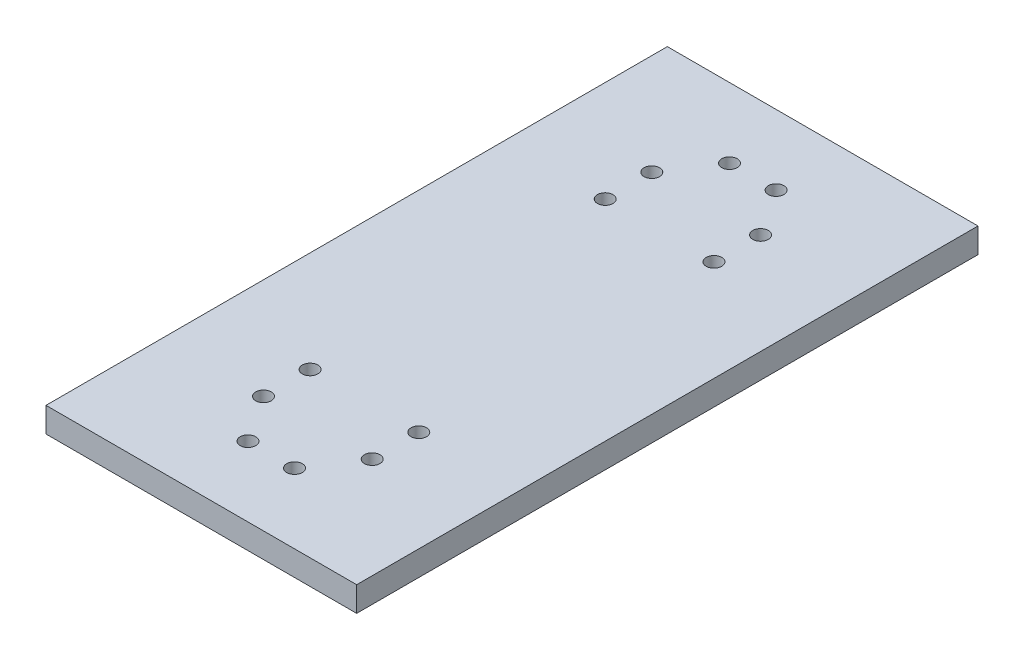
ISO-10303-21;
HEADER;
FILE_DESCRIPTION(('STEP AP214'),'2;1');
FILE_NAME('part.step','',(''),(''),'','','');
FILE_SCHEMA(('AUTOMOTIVE_DESIGN { 1 0 10303 214 1 1 1 1 }'));
ENDSEC;
DATA;
#1=APPLICATION_CONTEXT('core data for automotive mechanical design processes');
#2=APPLICATION_PROTOCOL_DEFINITION('international standard','automotive_design',2000,#1);
#3=PRODUCT_CONTEXT('',#1,'mechanical');
#4=PRODUCT('Part','Part','',(#3));
#5=PRODUCT_RELATED_PRODUCT_CATEGORY('part','',(#4));
#6=PRODUCT_DEFINITION_FORMATION('','',#4);
#7=PRODUCT_DEFINITION_CONTEXT('part definition',#1,'design');
#8=PRODUCT_DEFINITION('design','',#6,#7);
#9=PRODUCT_DEFINITION_SHAPE('','',#8);
#10=(LENGTH_UNIT() NAMED_UNIT(*) SI_UNIT(.MILLI.,.METRE.));
#11=(NAMED_UNIT(*) PLANE_ANGLE_UNIT() SI_UNIT($,.RADIAN.));
#12=(NAMED_UNIT(*) SI_UNIT($,.STERADIAN.) SOLID_ANGLE_UNIT());
#13=UNCERTAINTY_MEASURE_WITH_UNIT(LENGTH_MEASURE(1.E-05),#10,'distance_accuracy_value','');
#14=(GEOMETRIC_REPRESENTATION_CONTEXT(3) GLOBAL_UNCERTAINTY_ASSIGNED_CONTEXT((#13)) GLOBAL_UNIT_ASSIGNED_CONTEXT((#10,
#11,#12)) REPRESENTATION_CONTEXT('',''));
#15=CARTESIAN_POINT('',(0.,0.,0.));
#16=DIRECTION('',(0.,0.,1.));
#17=DIRECTION('',(1.,0.,0.));
#18=AXIS2_PLACEMENT_3D('',#15,#16,#17);
#19=CARTESIAN_POINT('',(-50.,8.,100.));
#20=DIRECTION('',(1.,0.,0.));
#21=DIRECTION('',(0.,0.,-1.));
#22=AXIS2_PLACEMENT_3D('',#19,#20,#21);
#23=PLANE('',#22);
#24=DIRECTION('',(0.,0.,1.));
#25=VECTOR('',#24,1.);
#26=CARTESIAN_POINT('',(-50.,0.,100.));
#27=LINE('',#26,#25);
#28=CARTESIAN_POINT('',(-50.,0.,-100.));
#29=VERTEX_POINT('',#28);
#30=CARTESIAN_POINT('',(-50.,0.,100.));
#31=VERTEX_POINT('',#30);
#32=EDGE_CURVE('E96',#29,#31,#27,.T.);
#33=ORIENTED_EDGE('',*,*,#32,.T.);
#34=DIRECTION('',(0.,-1.,0.));
#35=VECTOR('',#34,1.);
#36=CARTESIAN_POINT('',(-50.,8.,100.));
#37=LINE('',#36,#35);
#38=CARTESIAN_POINT('',(-50.,8.,100.));
#39=VERTEX_POINT('',#38);
#40=EDGE_CURVE('E11',#39,#31,#37,.T.);
#41=ORIENTED_EDGE('',*,*,#40,.F.);
#42=DIRECTION('',(0.,0.,1.));
#43=VECTOR('',#42,1.);
#44=CARTESIAN_POINT('',(-50.,8.,100.));
#45=LINE('',#44,#43);
#46=CARTESIAN_POINT('',(-50.,8.,-100.));
#47=VERTEX_POINT('',#46);
#48=EDGE_CURVE('E84',#47,#39,#45,.T.);
#49=ORIENTED_EDGE('',*,*,#48,.F.);
#50=DIRECTION('',(0.,-1.,0.));
#51=VECTOR('',#50,1.);
#52=CARTESIAN_POINT('',(-50.,8.,-100.));
#53=LINE('',#52,#51);
#54=EDGE_CURVE('E92',#47,#29,#53,.T.);
#55=ORIENTED_EDGE('',*,*,#54,.T.);
#56=EDGE_LOOP('',(#33,#41,#49,#55));
#57=FACE_BOUND('',#56,.T.);
#58=ADVANCED_FACE('F33',(#57),#23,.F.);
#59=CARTESIAN_POINT('',(50.,8.,100.));
#60=DIRECTION('',(0.,0.,-1.));
#61=DIRECTION('',(-1.,0.,0.));
#62=AXIS2_PLACEMENT_3D('',#59,#60,#61);
#63=PLANE('',#62);
#64=DIRECTION('',(1.,0.,0.));
#65=VECTOR('',#64,1.);
#66=CARTESIAN_POINT('',(50.,0.,100.));
#67=LINE('',#66,#65);
#68=CARTESIAN_POINT('',(50.,0.,100.));
#69=VERTEX_POINT('',#68);
#70=EDGE_CURVE('E88',#31,#69,#67,.T.);
#71=ORIENTED_EDGE('',*,*,#70,.T.);
#72=DIRECTION('',(0.,-1.,0.));
#73=VECTOR('',#72,1.);
#74=CARTESIAN_POINT('',(50.,8.,100.));
#75=LINE('',#74,#73);
#76=CARTESIAN_POINT('',(50.,8.,100.));
#77=VERTEX_POINT('',#76);
#78=EDGE_CURVE('E41',#77,#69,#75,.T.);
#79=ORIENTED_EDGE('',*,*,#78,.F.);
#80=DIRECTION('',(1.,0.,0.));
#81=VECTOR('',#80,1.);
#82=CARTESIAN_POINT('',(50.,8.,100.));
#83=LINE('',#82,#81);
#84=EDGE_CURVE('E79',#39,#77,#83,.T.);
#85=ORIENTED_EDGE('',*,*,#84,.F.);
#86=ORIENTED_EDGE('',*,*,#40,.T.);
#87=EDGE_LOOP('',(#71,#79,#85,#86));
#88=FACE_BOUND('',#87,.T.);
#89=ADVANCED_FACE('F87',(#88),#63,.F.);
#90=CARTESIAN_POINT('',(50.,8.,100.));
#91=DIRECTION('',(-1.,0.,0.));
#92=DIRECTION('',(0.,0.,1.));
#93=AXIS2_PLACEMENT_3D('',#90,#91,#92);
#94=PLANE('',#93);
#95=DIRECTION('',(0.,0.,-1.));
#96=VECTOR('',#95,1.);
#97=CARTESIAN_POINT('',(50.,0.,100.));
#98=LINE('',#97,#96);
#99=CARTESIAN_POINT('',(50.,0.,-100.));
#100=VERTEX_POINT('',#99);
#101=EDGE_CURVE('E66',#69,#100,#98,.T.);
#102=ORIENTED_EDGE('',*,*,#101,.T.);
#103=DIRECTION('',(0.,-1.,0.));
#104=VECTOR('',#103,1.);
#105=CARTESIAN_POINT('',(50.,8.,-100.));
#106=LINE('',#105,#104);
#107=CARTESIAN_POINT('',(50.,8.,-100.));
#108=VERTEX_POINT('',#107);
#109=EDGE_CURVE('E89',#108,#100,#106,.T.);
#110=ORIENTED_EDGE('',*,*,#109,.F.);
#111=DIRECTION('',(0.,0.,-1.));
#112=VECTOR('',#111,1.);
#113=CARTESIAN_POINT('',(50.,8.,100.));
#114=LINE('',#113,#112);
#115=EDGE_CURVE('E82',#77,#108,#114,.T.);
#116=ORIENTED_EDGE('',*,*,#115,.F.);
#117=ORIENTED_EDGE('',*,*,#78,.T.);
#118=EDGE_LOOP('',(#102,#110,#116,#117));
#119=FACE_BOUND('',#118,.T.);
#120=ADVANCED_FACE('F90',(#119),#94,.F.);
#121=CARTESIAN_POINT('',(50.,8.,-100.));
#122=DIRECTION('',(0.,0.,1.));
#123=DIRECTION('',(1.,0.,0.));
#124=AXIS2_PLACEMENT_3D('',#121,#122,#123);
#125=PLANE('',#124);
#126=DIRECTION('',(-1.,0.,0.));
#127=VECTOR('',#126,1.);
#128=CARTESIAN_POINT('',(50.,0.,-100.));
#129=LINE('',#128,#127);
#130=EDGE_CURVE('E72',#100,#29,#129,.T.);
#131=ORIENTED_EDGE('',*,*,#130,.T.);
#132=ORIENTED_EDGE('',*,*,#54,.F.);
#133=DIRECTION('',(-1.,0.,0.));
#134=VECTOR('',#133,1.);
#135=CARTESIAN_POINT('',(50.,8.,-100.));
#136=LINE('',#135,#134);
#137=EDGE_CURVE('E49',#108,#47,#136,.T.);
#138=ORIENTED_EDGE('',*,*,#137,.F.);
#139=ORIENTED_EDGE('',*,*,#109,.T.);
#140=EDGE_LOOP('',(#131,#132,#138,#139));
#141=FACE_BOUND('',#140,.T.);
#142=ADVANCED_FACE('F104',(#141),#125,.F.);
#143=CARTESIAN_POINT('',(0.,8.,0.));
#144=DIRECTION('',(0.,1.,0.));
#145=DIRECTION('',(0.,0.,1.));
#146=AXIS2_PLACEMENT_3D('',#143,#144,#145);
#147=PLANE('',#146);
#148=CARTESIAN_POINT('',(-7.49999999999884,8.00000000000572,77.5000000000039));
#149=DIRECTION('',(0.,-1.,0.));
#150=DIRECTION('',(0.,0.,1.));
#151=AXIS2_PLACEMENT_3D('',#148,#149,#150);
#152=CIRCLE('',#151,2.50000000000002);
#153=CARTESIAN_POINT('',(-7.49999999999884,8.00000000000572,80.0000000000039));
#154=VERTEX_POINT('',#153);
#155=EDGE_CURVE('E178',#154,#154,#152,.T.);
#156=ORIENTED_EDGE('',*,*,#155,.T.);
#157=EDGE_LOOP('',(#156));
#158=FACE_BOUND('',#157,.T.);
#159=CARTESIAN_POINT('',(-7.49999999999884,8.00000000000572,-77.5000000000039));
#160=DIRECTION('',(0.,1.,0.));
#161=DIRECTION('',(0.,0.,-1.));
#162=AXIS2_PLACEMENT_3D('',#159,#160,#161);
#163=CIRCLE('',#162,2.50000000000002);
#164=CARTESIAN_POINT('',(-7.49999999999884,8.00000000000572,-80.0000000000039));
#165=VERTEX_POINT('',#164);
#166=EDGE_CURVE('E172',#165,#165,#163,.T.);
#167=ORIENTED_EDGE('',*,*,#166,.F.);
#168=EDGE_LOOP('',(#167));
#169=FACE_BOUND('',#168,.T.);
#170=CARTESIAN_POINT('',(-17.5000000000032,8.00000000000572,47.5000000000039));
#171=DIRECTION('',(0.,-1.,0.));
#172=DIRECTION('',(0.,0.,1.));
#173=AXIS2_PLACEMENT_3D('',#170,#171,#172);
#174=CIRCLE('',#173,2.50000000000002);
#175=CARTESIAN_POINT('',(-17.5000000000032,8.00000000000572,50.0000000000039));
#176=VERTEX_POINT('',#175);
#177=EDGE_CURVE('E166',#176,#176,#174,.T.);
#178=ORIENTED_EDGE('',*,*,#177,.T.);
#179=EDGE_LOOP('',(#178));
#180=FACE_BOUND('',#179,.T.);
#181=CARTESIAN_POINT('',(-17.5000000000032,8.00000000000572,-47.5000000000039));
#182=DIRECTION('',(0.,1.,0.));
#183=DIRECTION('',(0.,0.,-1.));
#184=AXIS2_PLACEMENT_3D('',#181,#182,#183);
#185=CIRCLE('',#184,2.50000000000002);
#186=CARTESIAN_POINT('',(-17.5000000000032,8.00000000000572,-50.0000000000039));
#187=VERTEX_POINT('',#186);
#188=EDGE_CURVE('E160',#187,#187,#185,.T.);
#189=ORIENTED_EDGE('',*,*,#188,.F.);
#190=EDGE_LOOP('',(#189));
#191=FACE_BOUND('',#190,.T.);
#192=CARTESIAN_POINT('',(-17.5000000000032,8.00000000000572,62.5000000000038));
#193=DIRECTION('',(0.,-1.,0.));
#194=DIRECTION('',(0.,0.,1.));
#195=AXIS2_PLACEMENT_3D('',#192,#193,#194);
#196=CIRCLE('',#195,2.50000000000002);
#197=CARTESIAN_POINT('',(-17.5000000000032,8.00000000000572,65.0000000000039));
#198=VERTEX_POINT('',#197);
#199=EDGE_CURVE('E154',#198,#198,#196,.T.);
#200=ORIENTED_EDGE('',*,*,#199,.T.);
#201=EDGE_LOOP('',(#200));
#202=FACE_BOUND('',#201,.T.);
#203=CARTESIAN_POINT('',(-17.5000000000032,8.00000000000572,-62.5000000000038));
#204=DIRECTION('',(0.,1.,0.));
#205=DIRECTION('',(0.,0.,-1.));
#206=AXIS2_PLACEMENT_3D('',#203,#204,#205);
#207=CIRCLE('',#206,2.50000000000002);
#208=CARTESIAN_POINT('',(-17.5000000000032,8.00000000000572,-65.0000000000039));
#209=VERTEX_POINT('',#208);
#210=EDGE_CURVE('E148',#209,#209,#207,.T.);
#211=ORIENTED_EDGE('',*,*,#210,.F.);
#212=EDGE_LOOP('',(#211));
#213=FACE_BOUND('',#212,.T.);
#214=CARTESIAN_POINT('',(7.49999999999884,8.00000000000572,77.5000000000039));
#215=DIRECTION('',(0.,1.,0.));
#216=DIRECTION('',(0.,0.,1.));
#217=AXIS2_PLACEMENT_3D('',#214,#215,#216);
#218=CIRCLE('',#217,2.50000000000002);
#219=CARTESIAN_POINT('',(7.49999999999884,8.00000000000572,80.0000000000039));
#220=VERTEX_POINT('',#219);
#221=EDGE_CURVE('E142',#220,#220,#218,.T.);
#222=ORIENTED_EDGE('',*,*,#221,.F.);
#223=EDGE_LOOP('',(#222));
#224=FACE_BOUND('',#223,.T.);
#225=CARTESIAN_POINT('',(17.5000000000032,8.00000000000572,47.5000000000039));
#226=DIRECTION('',(0.,1.,0.));
#227=DIRECTION('',(0.,0.,1.));
#228=AXIS2_PLACEMENT_3D('',#225,#226,#227);
#229=CIRCLE('',#228,2.50000000000002);
#230=CARTESIAN_POINT('',(17.5000000000032,8.00000000000572,50.0000000000039));
#231=VERTEX_POINT('',#230);
#232=EDGE_CURVE('E136',#231,#231,#229,.T.);
#233=ORIENTED_EDGE('',*,*,#232,.F.);
#234=EDGE_LOOP('',(#233));
#235=FACE_BOUND('',#234,.T.);
#236=CARTESIAN_POINT('',(17.5000000000032,8.00000000000572,62.5000000000038));
#237=DIRECTION('',(0.,1.,0.));
#238=DIRECTION('',(0.,0.,1.));
#239=AXIS2_PLACEMENT_3D('',#236,#237,#238);
#240=CIRCLE('',#239,2.50000000000002);
#241=CARTESIAN_POINT('',(17.5000000000032,8.00000000000572,65.0000000000039));
#242=VERTEX_POINT('',#241);
#243=EDGE_CURVE('E130',#242,#242,#240,.T.);
#244=ORIENTED_EDGE('',*,*,#243,.F.);
#245=EDGE_LOOP('',(#244));
#246=FACE_BOUND('',#245,.T.);
#247=CARTESIAN_POINT('',(7.49999999999884,8.00000000000572,-77.5000000000039));
#248=DIRECTION('',(0.,-1.,0.));
#249=DIRECTION('',(0.,0.,-1.));
#250=AXIS2_PLACEMENT_3D('',#247,#248,#249);
#251=CIRCLE('',#250,2.50000000000002);
#252=CARTESIAN_POINT('',(7.49999999999884,8.00000000000572,-80.0000000000039));
#253=VERTEX_POINT('',#252);
#254=EDGE_CURVE('E119',#253,#253,#251,.T.);
#255=ORIENTED_EDGE('',*,*,#254,.T.);
#256=EDGE_LOOP('',(#255));
#257=FACE_BOUND('',#256,.T.);
#258=CARTESIAN_POINT('',(17.5000000000032,8.00000000000572,-47.5000000000039));
#259=DIRECTION('',(0.,-1.,0.));
#260=DIRECTION('',(0.,0.,-1.));
#261=AXIS2_PLACEMENT_3D('',#258,#259,#260);
#262=CIRCLE('',#261,2.50000000000002);
#263=CARTESIAN_POINT('',(17.5000000000032,8.00000000000572,-50.0000000000039));
#264=VERTEX_POINT('',#263);
#265=EDGE_CURVE('E113',#264,#264,#262,.T.);
#266=ORIENTED_EDGE('',*,*,#265,.T.);
#267=EDGE_LOOP('',(#266));
#268=FACE_BOUND('',#267,.T.);
#269=CARTESIAN_POINT('',(17.5000000000032,8.00000000000572,-62.5000000000038));
#270=DIRECTION('',(0.,-1.,0.));
#271=DIRECTION('',(0.,0.,-1.));
#272=AXIS2_PLACEMENT_3D('',#269,#270,#271);
#273=CIRCLE('',#272,2.50000000000002);
#274=CARTESIAN_POINT('',(17.5000000000032,8.00000000000572,-65.0000000000039));
#275=VERTEX_POINT('',#274);
#276=EDGE_CURVE('E99',#275,#275,#273,.T.);
#277=ORIENTED_EDGE('',*,*,#276,.T.);
#278=EDGE_LOOP('',(#277));
#279=FACE_BOUND('',#278,.T.);
#280=ORIENTED_EDGE('',*,*,#48,.T.);
#281=ORIENTED_EDGE('',*,*,#84,.T.);
#282=ORIENTED_EDGE('',*,*,#115,.T.);
#283=ORIENTED_EDGE('',*,*,#137,.T.);
#284=EDGE_LOOP('',(#280,#281,#282,#283));
#285=FACE_BOUND('',#284,.T.);
#286=ADVANCED_FACE('F80',(#158,#169,#180,#191,#202,#213,#224,#235,#246,#257,#268,#279,#285),
#147,.T.);
#287=CARTESIAN_POINT('',(0.,0.,0.));
#288=DIRECTION('',(0.,1.,0.));
#289=DIRECTION('',(0.,0.,1.));
#290=AXIS2_PLACEMENT_3D('',#287,#288,#289);
#291=PLANE('',#290);
#292=CARTESIAN_POINT('',(-7.49999999999884,5.71764857681956E-12,77.5000000000039));
#293=DIRECTION('',(0.,-1.,0.));
#294=DIRECTION('',(0.,0.,1.));
#295=AXIS2_PLACEMENT_3D('',#292,#293,#294);
#296=CIRCLE('',#295,2.50000000000002);
#297=CARTESIAN_POINT('',(-7.49999999999884,5.71764857681956E-12,80.0000000000039));
#298=VERTEX_POINT('',#297);
#299=EDGE_CURVE('E175',#298,#298,#296,.T.);
#300=ORIENTED_EDGE('',*,*,#299,.F.);
#301=EDGE_LOOP('',(#300));
#302=FACE_BOUND('',#301,.T.);
#303=CARTESIAN_POINT('',(-7.49999999999884,5.71764857681956E-12,-77.5000000000039));
#304=DIRECTION('',(0.,1.,0.));
#305=DIRECTION('',(0.,0.,-1.));
#306=AXIS2_PLACEMENT_3D('',#303,#304,#305);
#307=CIRCLE('',#306,2.50000000000002);
#308=CARTESIAN_POINT('',(-7.49999999999884,5.71764857681956E-12,-80.0000000000039));
#309=VERTEX_POINT('',#308);
#310=EDGE_CURVE('E169',#309,#309,#307,.T.);
#311=ORIENTED_EDGE('',*,*,#310,.T.);
#312=EDGE_LOOP('',(#311));
#313=FACE_BOUND('',#312,.T.);
#314=CARTESIAN_POINT('',(-17.5000000000032,5.71764857681956E-12,47.5000000000039));
#315=DIRECTION('',(0.,-1.,0.));
#316=DIRECTION('',(0.,0.,1.));
#317=AXIS2_PLACEMENT_3D('',#314,#315,#316);
#318=CIRCLE('',#317,2.50000000000002);
#319=CARTESIAN_POINT('',(-17.5000000000032,5.71764857681956E-12,50.0000000000039));
#320=VERTEX_POINT('',#319);
#321=EDGE_CURVE('E163',#320,#320,#318,.T.);
#322=ORIENTED_EDGE('',*,*,#321,.F.);
#323=EDGE_LOOP('',(#322));
#324=FACE_BOUND('',#323,.T.);
#325=CARTESIAN_POINT('',(-17.5000000000032,5.71764857681956E-12,-47.5000000000039));
#326=DIRECTION('',(0.,1.,0.));
#327=DIRECTION('',(0.,0.,-1.));
#328=AXIS2_PLACEMENT_3D('',#325,#326,#327);
#329=CIRCLE('',#328,2.50000000000002);
#330=CARTESIAN_POINT('',(-17.5000000000032,5.71764857681956E-12,-50.0000000000039));
#331=VERTEX_POINT('',#330);
#332=EDGE_CURVE('E157',#331,#331,#329,.T.);
#333=ORIENTED_EDGE('',*,*,#332,.T.);
#334=EDGE_LOOP('',(#333));
#335=FACE_BOUND('',#334,.T.);
#336=CARTESIAN_POINT('',(-17.5000000000032,5.71764857681956E-12,62.5000000000038));
#337=DIRECTION('',(0.,-1.,0.));
#338=DIRECTION('',(0.,0.,1.));
#339=AXIS2_PLACEMENT_3D('',#336,#337,#338);
#340=CIRCLE('',#339,2.50000000000002);
#341=CARTESIAN_POINT('',(-17.5000000000032,5.71764857681956E-12,65.0000000000039));
#342=VERTEX_POINT('',#341);
#343=EDGE_CURVE('E151',#342,#342,#340,.T.);
#344=ORIENTED_EDGE('',*,*,#343,.F.);
#345=EDGE_LOOP('',(#344));
#346=FACE_BOUND('',#345,.T.);
#347=CARTESIAN_POINT('',(-17.5000000000032,5.71764857681956E-12,-62.5000000000038));
#348=DIRECTION('',(0.,1.,0.));
#349=DIRECTION('',(0.,0.,-1.));
#350=AXIS2_PLACEMENT_3D('',#347,#348,#349);
#351=CIRCLE('',#350,2.50000000000002);
#352=CARTESIAN_POINT('',(-17.5000000000032,5.71764857681956E-12,-65.0000000000039));
#353=VERTEX_POINT('',#352);
#354=EDGE_CURVE('E145',#353,#353,#351,.T.);
#355=ORIENTED_EDGE('',*,*,#354,.T.);
#356=EDGE_LOOP('',(#355));
#357=FACE_BOUND('',#356,.T.);
#358=CARTESIAN_POINT('',(7.49999999999884,5.71764857681956E-12,77.5000000000039));
#359=DIRECTION('',(0.,1.,0.));
#360=DIRECTION('',(0.,0.,1.));
#361=AXIS2_PLACEMENT_3D('',#358,#359,#360);
#362=CIRCLE('',#361,2.50000000000002);
#363=CARTESIAN_POINT('',(7.49999999999884,5.71764857681956E-12,80.0000000000039));
#364=VERTEX_POINT('',#363);
#365=EDGE_CURVE('E139',#364,#364,#362,.T.);
#366=ORIENTED_EDGE('',*,*,#365,.T.);
#367=EDGE_LOOP('',(#366));
#368=FACE_BOUND('',#367,.T.);
#369=CARTESIAN_POINT('',(17.5000000000032,5.71764857681956E-12,47.5000000000039));
#370=DIRECTION('',(0.,1.,0.));
#371=DIRECTION('',(0.,0.,1.));
#372=AXIS2_PLACEMENT_3D('',#369,#370,#371);
#373=CIRCLE('',#372,2.50000000000002);
#374=CARTESIAN_POINT('',(17.5000000000032,5.71764857681956E-12,50.0000000000039));
#375=VERTEX_POINT('',#374);
#376=EDGE_CURVE('E133',#375,#375,#373,.T.);
#377=ORIENTED_EDGE('',*,*,#376,.T.);
#378=EDGE_LOOP('',(#377));
#379=FACE_BOUND('',#378,.T.);
#380=CARTESIAN_POINT('',(17.5000000000032,5.71764857681956E-12,62.5000000000038));
#381=DIRECTION('',(0.,1.,0.));
#382=DIRECTION('',(0.,0.,1.));
#383=AXIS2_PLACEMENT_3D('',#380,#381,#382);
#384=CIRCLE('',#383,2.50000000000002);
#385=CARTESIAN_POINT('',(17.5000000000032,5.71764857681956E-12,65.0000000000039));
#386=VERTEX_POINT('',#385);
#387=EDGE_CURVE('E125',#386,#386,#384,.T.);
#388=ORIENTED_EDGE('',*,*,#387,.T.);
#389=EDGE_LOOP('',(#388));
#390=FACE_BOUND('',#389,.T.);
#391=CARTESIAN_POINT('',(7.49999999999884,5.71764857681956E-12,-77.5000000000039));
#392=DIRECTION('',(0.,-1.,0.));
#393=DIRECTION('',(0.,0.,-1.));
#394=AXIS2_PLACEMENT_3D('',#391,#392,#393);
#395=CIRCLE('',#394,2.50000000000002);
#396=CARTESIAN_POINT('',(7.49999999999884,5.71764857681956E-12,-80.0000000000039));
#397=VERTEX_POINT('',#396);
#398=EDGE_CURVE('E122',#397,#397,#395,.T.);
#399=ORIENTED_EDGE('',*,*,#398,.F.);
#400=EDGE_LOOP('',(#399));
#401=FACE_BOUND('',#400,.T.);
#402=CARTESIAN_POINT('',(17.5000000000032,5.71764857681956E-12,-47.5000000000039));
#403=DIRECTION('',(0.,-1.,0.));
#404=DIRECTION('',(0.,0.,-1.));
#405=AXIS2_PLACEMENT_3D('',#402,#403,#404);
#406=CIRCLE('',#405,2.50000000000002);
#407=CARTESIAN_POINT('',(17.5000000000032,5.71764857681956E-12,-50.0000000000039));
#408=VERTEX_POINT('',#407);
#409=EDGE_CURVE('E116',#408,#408,#406,.T.);
#410=ORIENTED_EDGE('',*,*,#409,.F.);
#411=EDGE_LOOP('',(#410));
#412=FACE_BOUND('',#411,.T.);
#413=CARTESIAN_POINT('',(17.5000000000032,5.71764857681956E-12,-62.5000000000038));
#414=DIRECTION('',(0.,-1.,0.));
#415=DIRECTION('',(0.,0.,-1.));
#416=AXIS2_PLACEMENT_3D('',#413,#414,#415);
#417=CIRCLE('',#416,2.50000000000002);
#418=CARTESIAN_POINT('',(17.5000000000032,5.71764857681956E-12,-65.0000000000039));
#419=VERTEX_POINT('',#418);
#420=EDGE_CURVE('E110',#419,#419,#417,.T.);
#421=ORIENTED_EDGE('',*,*,#420,.F.);
#422=EDGE_LOOP('',(#421));
#423=FACE_BOUND('',#422,.T.);
#424=ORIENTED_EDGE('',*,*,#32,.F.);
#425=ORIENTED_EDGE('',*,*,#130,.F.);
#426=ORIENTED_EDGE('',*,*,#101,.F.);
#427=ORIENTED_EDGE('',*,*,#70,.F.);
#428=EDGE_LOOP('',(#424,#425,#426,#427));
#429=FACE_BOUND('',#428,.T.);
#430=ADVANCED_FACE('F107',(#302,#313,#324,#335,#346,#357,#368,#379,#390,#401,#412,#423,#429),
#291,.F.);
#431=CARTESIAN_POINT('',(17.5000000000032,8.00000000000572,-62.5000000000038));
#432=DIRECTION('',(0.,-1.,0.));
#433=DIRECTION('',(0.,0.,-1.));
#434=AXIS2_PLACEMENT_3D('',#431,#432,#433);
#435=CYLINDRICAL_SURFACE('',#434,2.50000000000002);
#436=ORIENTED_EDGE('',*,*,#276,.F.);
#437=EDGE_LOOP('',(#436));
#438=FACE_BOUND('',#437,.T.);
#439=ORIENTED_EDGE('',*,*,#420,.T.);
#440=EDGE_LOOP('',(#439));
#441=FACE_BOUND('',#440,.T.);
#442=ADVANCED_FACE('F193',(#438,#441),#435,.F.);
#443=CARTESIAN_POINT('',(17.5000000000032,8.00000000000572,-47.5000000000039));
#444=DIRECTION('',(0.,-1.,0.));
#445=DIRECTION('',(0.,0.,-1.));
#446=AXIS2_PLACEMENT_3D('',#443,#444,#445);
#447=CYLINDRICAL_SURFACE('',#446,2.50000000000002);
#448=ORIENTED_EDGE('',*,*,#265,.F.);
#449=EDGE_LOOP('',(#448));
#450=FACE_BOUND('',#449,.T.);
#451=ORIENTED_EDGE('',*,*,#409,.T.);
#452=EDGE_LOOP('',(#451));
#453=FACE_BOUND('',#452,.T.);
#454=ADVANCED_FACE('F218',(#450,#453),#447,.F.);
#455=CARTESIAN_POINT('',(7.49999999999884,8.00000000000572,-77.5000000000039));
#456=DIRECTION('',(0.,-1.,0.));
#457=DIRECTION('',(0.,0.,-1.));
#458=AXIS2_PLACEMENT_3D('',#455,#456,#457);
#459=CYLINDRICAL_SURFACE('',#458,2.50000000000002);
#460=ORIENTED_EDGE('',*,*,#254,.F.);
#461=EDGE_LOOP('',(#460));
#462=FACE_BOUND('',#461,.T.);
#463=ORIENTED_EDGE('',*,*,#398,.T.);
#464=EDGE_LOOP('',(#463));
#465=FACE_BOUND('',#464,.T.);
#466=ADVANCED_FACE('F224',(#462,#465),#459,.F.);
#467=CARTESIAN_POINT('',(17.5000000000032,8.00000000000572,62.5000000000038));
#468=DIRECTION('',(0.,-1.,0.));
#469=DIRECTION('',(0.,0.,1.));
#470=AXIS2_PLACEMENT_3D('',#467,#468,#469);
#471=CYLINDRICAL_SURFACE('',#470,2.50000000000002);
#472=ORIENTED_EDGE('',*,*,#243,.T.);
#473=EDGE_LOOP('',(#472));
#474=FACE_BOUND('',#473,.T.);
#475=ORIENTED_EDGE('',*,*,#387,.F.);
#476=EDGE_LOOP('',(#475));
#477=FACE_BOUND('',#476,.T.);
#478=ADVANCED_FACE('F319',(#474,#477),#471,.F.);
#479=CARTESIAN_POINT('',(17.5000000000032,8.00000000000572,47.5000000000039));
#480=DIRECTION('',(0.,-1.,0.));
#481=DIRECTION('',(0.,0.,1.));
#482=AXIS2_PLACEMENT_3D('',#479,#480,#481);
#483=CYLINDRICAL_SURFACE('',#482,2.50000000000002);
#484=ORIENTED_EDGE('',*,*,#232,.T.);
#485=EDGE_LOOP('',(#484));
#486=FACE_BOUND('',#485,.T.);
#487=ORIENTED_EDGE('',*,*,#376,.F.);
#488=EDGE_LOOP('',(#487));
#489=FACE_BOUND('',#488,.T.);
#490=ADVANCED_FACE('F315',(#486,#489),#483,.F.);
#491=CARTESIAN_POINT('',(7.49999999999884,8.00000000000572,77.5000000000039));
#492=DIRECTION('',(0.,-1.,0.));
#493=DIRECTION('',(0.,0.,1.));
#494=AXIS2_PLACEMENT_3D('',#491,#492,#493);
#495=CYLINDRICAL_SURFACE('',#494,2.50000000000002);
#496=ORIENTED_EDGE('',*,*,#221,.T.);
#497=EDGE_LOOP('',(#496));
#498=FACE_BOUND('',#497,.T.);
#499=ORIENTED_EDGE('',*,*,#365,.F.);
#500=EDGE_LOOP('',(#499));
#501=FACE_BOUND('',#500,.T.);
#502=ADVANCED_FACE('F261',(#498,#501),#495,.F.);
#503=CARTESIAN_POINT('',(-17.5000000000032,8.00000000000572,-62.5000000000038));
#504=DIRECTION('',(0.,-1.,0.));
#505=DIRECTION('',(0.,0.,-1.));
#506=AXIS2_PLACEMENT_3D('',#503,#504,#505);
#507=CYLINDRICAL_SURFACE('',#506,2.50000000000002);
#508=ORIENTED_EDGE('',*,*,#210,.T.);
#509=EDGE_LOOP('',(#508));
#510=FACE_BOUND('',#509,.T.);
#511=ORIENTED_EDGE('',*,*,#354,.F.);
#512=EDGE_LOOP('',(#511));
#513=FACE_BOUND('',#512,.T.);
#514=ADVANCED_FACE('F255',(#510,#513),#507,.F.);
#515=CARTESIAN_POINT('',(-17.5000000000032,8.00000000000572,62.5000000000038));
#516=DIRECTION('',(0.,-1.,0.));
#517=DIRECTION('',(0.,0.,1.));
#518=AXIS2_PLACEMENT_3D('',#515,#516,#517);
#519=CYLINDRICAL_SURFACE('',#518,2.50000000000002);
#520=ORIENTED_EDGE('',*,*,#199,.F.);
#521=EDGE_LOOP('',(#520));
#522=FACE_BOUND('',#521,.T.);
#523=ORIENTED_EDGE('',*,*,#343,.T.);
#524=EDGE_LOOP('',(#523));
#525=FACE_BOUND('',#524,.T.);
#526=ADVANCED_FACE('F260',(#522,#525),#519,.F.);
#527=CARTESIAN_POINT('',(-17.5000000000032,8.00000000000572,-47.5000000000039));
#528=DIRECTION('',(0.,-1.,0.));
#529=DIRECTION('',(0.,0.,-1.));
#530=AXIS2_PLACEMENT_3D('',#527,#528,#529);
#531=CYLINDRICAL_SURFACE('',#530,2.50000000000002);
#532=ORIENTED_EDGE('',*,*,#188,.T.);
#533=EDGE_LOOP('',(#532));
#534=FACE_BOUND('',#533,.T.);
#535=ORIENTED_EDGE('',*,*,#332,.F.);
#536=EDGE_LOOP('',(#535));
#537=FACE_BOUND('',#536,.T.);
#538=ADVANCED_FACE('F273',(#534,#537),#531,.F.);
#539=CARTESIAN_POINT('',(-17.5000000000032,8.00000000000572,47.5000000000039));
#540=DIRECTION('',(0.,-1.,0.));
#541=DIRECTION('',(0.,0.,1.));
#542=AXIS2_PLACEMENT_3D('',#539,#540,#541);
#543=CYLINDRICAL_SURFACE('',#542,2.50000000000002);
#544=ORIENTED_EDGE('',*,*,#177,.F.);
#545=EDGE_LOOP('',(#544));
#546=FACE_BOUND('',#545,.T.);
#547=ORIENTED_EDGE('',*,*,#321,.T.);
#548=EDGE_LOOP('',(#547));
#549=FACE_BOUND('',#548,.T.);
#550=ADVANCED_FACE('F283',(#546,#549),#543,.F.);
#551=CARTESIAN_POINT('',(-7.49999999999884,8.00000000000572,-77.5000000000039));
#552=DIRECTION('',(0.,-1.,0.));
#553=DIRECTION('',(0.,0.,-1.));
#554=AXIS2_PLACEMENT_3D('',#551,#552,#553);
#555=CYLINDRICAL_SURFACE('',#554,2.50000000000002);
#556=ORIENTED_EDGE('',*,*,#166,.T.);
#557=EDGE_LOOP('',(#556));
#558=FACE_BOUND('',#557,.T.);
#559=ORIENTED_EDGE('',*,*,#310,.F.);
#560=EDGE_LOOP('',(#559));
#561=FACE_BOUND('',#560,.T.);
#562=ADVANCED_FACE('F187',(#558,#561),#555,.F.);
#563=CARTESIAN_POINT('',(-7.49999999999884,8.00000000000572,77.5000000000039));
#564=DIRECTION('',(0.,-1.,0.));
#565=DIRECTION('',(0.,0.,1.));
#566=AXIS2_PLACEMENT_3D('',#563,#564,#565);
#567=CYLINDRICAL_SURFACE('',#566,2.50000000000002);
#568=ORIENTED_EDGE('',*,*,#155,.F.);
#569=EDGE_LOOP('',(#568));
#570=FACE_BOUND('',#569,.T.);
#571=ORIENTED_EDGE('',*,*,#299,.T.);
#572=EDGE_LOOP('',(#571));
#573=FACE_BOUND('',#572,.T.);
#574=ADVANCED_FACE('F184',(#570,#573),#567,.F.);
#575=CLOSED_SHELL('',(#58,#89,#120,#142,#286,#430,#442,#454,#466,#478,#490,#502,#514,#526,#538,
#550,#562,#574));
#576=MANIFOLD_SOLID_BREP('B2',#575);
#577=ADVANCED_BREP_SHAPE_REPRESENTATION('',(#18,#576),#14);
#578=SHAPE_DEFINITION_REPRESENTATION(#9,#577);
ENDSEC;
END-ISO-10303-21;
